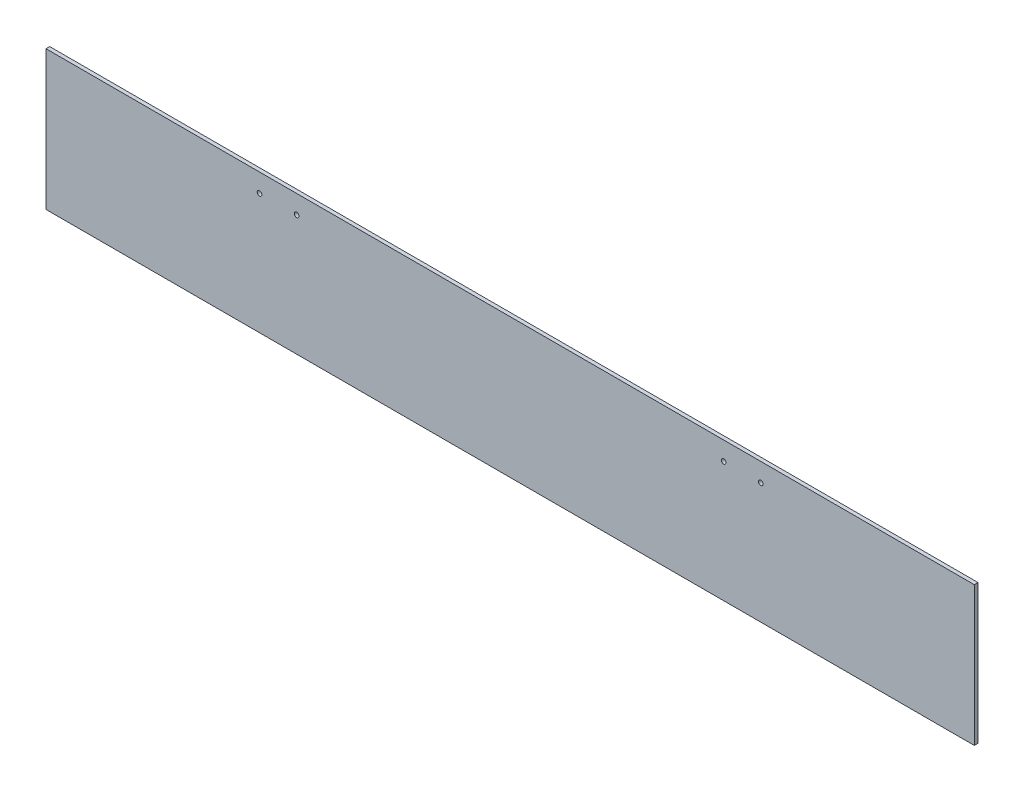
ISO-10303-21;
HEADER;
FILE_DESCRIPTION(('STEP AP214'),'2;1');
FILE_NAME('part.step','',(''),(''),'','','');
FILE_SCHEMA(('AUTOMOTIVE_DESIGN { 1 0 10303 214 1 1 1 1 }'));
ENDSEC;
DATA;
#1=APPLICATION_CONTEXT('core data for automotive mechanical design processes');
#2=APPLICATION_PROTOCOL_DEFINITION('international standard','automotive_design',2000,#1);
#3=PRODUCT_CONTEXT('',#1,'mechanical');
#4=PRODUCT('Part','Part','',(#3));
#5=PRODUCT_RELATED_PRODUCT_CATEGORY('part','',(#4));
#6=PRODUCT_DEFINITION_FORMATION('','',#4);
#7=PRODUCT_DEFINITION_CONTEXT('part definition',#1,'design');
#8=PRODUCT_DEFINITION('design','',#6,#7);
#9=PRODUCT_DEFINITION_SHAPE('','',#8);
#10=(LENGTH_UNIT() NAMED_UNIT(*) SI_UNIT(.MILLI.,.METRE.));
#11=(NAMED_UNIT(*) PLANE_ANGLE_UNIT() SI_UNIT($,.RADIAN.));
#12=(NAMED_UNIT(*) SI_UNIT($,.STERADIAN.) SOLID_ANGLE_UNIT());
#13=UNCERTAINTY_MEASURE_WITH_UNIT(LENGTH_MEASURE(1.E-05),#10,'distance_accuracy_value','');
#14=(GEOMETRIC_REPRESENTATION_CONTEXT(3) GLOBAL_UNCERTAINTY_ASSIGNED_CONTEXT((#13)) GLOBAL_UNIT_ASSIGNED_CONTEXT((#10,
#11,#12)) REPRESENTATION_CONTEXT('',''));
#15=CARTESIAN_POINT('',(0.,0.,0.));
#16=DIRECTION('',(0.,0.,1.));
#17=DIRECTION('',(1.,0.,0.));
#18=AXIS2_PLACEMENT_3D('',#15,#16,#17);
#19=CARTESIAN_POINT('',(-500.000000000002,150.,2.));
#20=DIRECTION('',(1.,0.,0.));
#21=DIRECTION('',(0.,1.,0.));
#22=AXIS2_PLACEMENT_3D('',#19,#20,#21);
#23=PLANE('',#22);
#24=DIRECTION('',(0.,-1.,0.));
#25=VECTOR('',#24,1.);
#26=CARTESIAN_POINT('',(-500.000000000002,150.,-2.));
#27=LINE('',#26,#25);
#28=CARTESIAN_POINT('',(-500.000000000002,150.,-2.));
#29=VERTEX_POINT('',#28);
#30=CARTESIAN_POINT('',(-500.,-1.66533453693773E-13,-2.));
#31=VERTEX_POINT('',#30);
#32=EDGE_CURVE('E105',#29,#31,#27,.T.);
#33=ORIENTED_EDGE('',*,*,#32,.T.);
#34=DIRECTION('',(0.,0.,-1.));
#35=VECTOR('',#34,1.);
#36=CARTESIAN_POINT('',(-500.,-1.66533453693773E-13,2.));
#37=LINE('',#36,#35);
#38=CARTESIAN_POINT('',(-500.,-1.66533453693773E-13,2.));
#39=VERTEX_POINT('',#38);
#40=EDGE_CURVE('E11',#39,#31,#37,.T.);
#41=ORIENTED_EDGE('',*,*,#40,.F.);
#42=DIRECTION('',(0.,-1.,0.));
#43=VECTOR('',#42,1.);
#44=CARTESIAN_POINT('',(-500.000000000002,150.,2.));
#45=LINE('',#44,#43);
#46=CARTESIAN_POINT('',(-500.000000000002,150.,2.));
#47=VERTEX_POINT('',#46);
#48=EDGE_CURVE('E89',#47,#39,#45,.T.);
#49=ORIENTED_EDGE('',*,*,#48,.F.);
#50=DIRECTION('',(0.,0.,-1.));
#51=VECTOR('',#50,1.);
#52=CARTESIAN_POINT('',(-500.000000000002,150.,2.));
#53=LINE('',#52,#51);
#54=EDGE_CURVE('E98',#47,#29,#53,.T.);
#55=ORIENTED_EDGE('',*,*,#54,.T.);
#56=EDGE_LOOP('',(#33,#41,#49,#55));
#57=FACE_BOUND('',#56,.T.);
#58=ADVANCED_FACE('F39',(#57),#23,.F.);
#59=CARTESIAN_POINT('',(500.,1.39628246093065E-13,2.));
#60=DIRECTION('',(0.,1.,0.));
#61=DIRECTION('',(-1.,0.,0.));
#62=AXIS2_PLACEMENT_3D('',#59,#60,#61);
#63=PLANE('',#62);
#64=DIRECTION('',(1.,0.,0.));
#65=VECTOR('',#64,1.);
#66=CARTESIAN_POINT('',(500.,1.39628246093065E-13,-2.));
#67=LINE('',#66,#65);
#68=CARTESIAN_POINT('',(500.,1.39628246093065E-13,-2.));
#69=VERTEX_POINT('',#68);
#70=EDGE_CURVE('E94',#31,#69,#67,.T.);
#71=ORIENTED_EDGE('',*,*,#70,.T.);
#72=DIRECTION('',(0.,0.,-1.));
#73=VECTOR('',#72,1.);
#74=CARTESIAN_POINT('',(500.,1.39628246093065E-13,2.));
#75=LINE('',#74,#73);
#76=CARTESIAN_POINT('',(500.,1.39628246093065E-13,2.));
#77=VERTEX_POINT('',#76);
#78=EDGE_CURVE('E50',#77,#69,#75,.T.);
#79=ORIENTED_EDGE('',*,*,#78,.F.);
#80=DIRECTION('',(1.,0.,0.));
#81=VECTOR('',#80,1.);
#82=CARTESIAN_POINT('',(500.,1.39628246093065E-13,2.));
#83=LINE('',#82,#81);
#84=EDGE_CURVE('E85',#39,#77,#83,.T.);
#85=ORIENTED_EDGE('',*,*,#84,.F.);
#86=ORIENTED_EDGE('',*,*,#40,.T.);
#87=EDGE_LOOP('',(#71,#79,#85,#86));
#88=FACE_BOUND('',#87,.T.);
#89=ADVANCED_FACE('F91',(#88),#63,.F.);
#90=CARTESIAN_POINT('',(500.000000000002,150.,2.));
#91=DIRECTION('',(-1.,0.,0.));
#92=DIRECTION('',(0.,-1.,0.));
#93=AXIS2_PLACEMENT_3D('',#90,#91,#92);
#94=PLANE('',#93);
#95=DIRECTION('',(0.,1.,0.));
#96=VECTOR('',#95,1.);
#97=CARTESIAN_POINT('',(500.000000000002,150.,-2.));
#98=LINE('',#97,#96);
#99=CARTESIAN_POINT('',(500.000000000002,150.,-2.));
#100=VERTEX_POINT('',#99);
#101=EDGE_CURVE('E75',#69,#100,#98,.T.);
#102=ORIENTED_EDGE('',*,*,#101,.T.);
#103=DIRECTION('',(0.,0.,-1.));
#104=VECTOR('',#103,1.);
#105=CARTESIAN_POINT('',(500.000000000002,150.,2.));
#106=LINE('',#105,#104);
#107=CARTESIAN_POINT('',(500.000000000002,150.,2.));
#108=VERTEX_POINT('',#107);
#109=EDGE_CURVE('E92',#108,#100,#106,.T.);
#110=ORIENTED_EDGE('',*,*,#109,.F.);
#111=DIRECTION('',(0.,1.,0.));
#112=VECTOR('',#111,1.);
#113=CARTESIAN_POINT('',(500.000000000002,150.,2.));
#114=LINE('',#113,#112);
#115=EDGE_CURVE('E86',#77,#108,#114,.T.);
#116=ORIENTED_EDGE('',*,*,#115,.F.);
#117=ORIENTED_EDGE('',*,*,#78,.T.);
#118=EDGE_LOOP('',(#102,#110,#116,#117));
#119=FACE_BOUND('',#118,.T.);
#120=ADVANCED_FACE('F96',(#119),#94,.F.);
#121=CARTESIAN_POINT('',(500.000000000002,150.,2.));
#122=DIRECTION('',(0.,-1.,0.));
#123=DIRECTION('',(1.,0.,0.));
#124=AXIS2_PLACEMENT_3D('',#121,#122,#123);
#125=PLANE('',#124);
#126=DIRECTION('',(-1.,0.,0.));
#127=VECTOR('',#126,1.);
#128=CARTESIAN_POINT('',(500.000000000002,150.,-2.));
#129=LINE('',#128,#127);
#130=EDGE_CURVE('E80',#100,#29,#129,.T.);
#131=ORIENTED_EDGE('',*,*,#130,.T.);
#132=ORIENTED_EDGE('',*,*,#54,.F.);
#133=DIRECTION('',(-1.,0.,0.));
#134=VECTOR('',#133,1.);
#135=CARTESIAN_POINT('',(500.000000000002,150.,2.));
#136=LINE('',#135,#134);
#137=EDGE_CURVE('E54',#108,#47,#136,.T.);
#138=ORIENTED_EDGE('',*,*,#137,.F.);
#139=ORIENTED_EDGE('',*,*,#109,.T.);
#140=EDGE_LOOP('',(#131,#132,#138,#139));
#141=FACE_BOUND('',#140,.T.);
#142=ADVANCED_FACE('F109',(#141),#125,.F.);
#143=CARTESIAN_POINT('',(0.,0.,2.));
#144=DIRECTION('',(0.,0.,-1.));
#145=DIRECTION('',(-1.,0.,0.));
#146=AXIS2_PLACEMENT_3D('',#143,#144,#145);
#147=PLANE('',#146);
#148=CARTESIAN_POINT('',(-270.000000000002,130.,2.));
#149=DIRECTION('',(0.,0.,1.));
#150=DIRECTION('',(1.,0.,0.));
#151=AXIS2_PLACEMENT_3D('',#148,#149,#150);
#152=CIRCLE('',#151,2.5);
#153=CARTESIAN_POINT('',(-267.500000000002,130.,2.));
#154=VERTEX_POINT('',#153);
#155=EDGE_CURVE('E136',#154,#154,#152,.T.);
#156=ORIENTED_EDGE('',*,*,#155,.F.);
#157=EDGE_LOOP('',(#156));
#158=FACE_BOUND('',#157,.T.);
#159=CARTESIAN_POINT('',(-230.000000000002,130.,2.));
#160=DIRECTION('',(0.,0.,1.));
#161=DIRECTION('',(1.,0.,0.));
#162=AXIS2_PLACEMENT_3D('',#159,#160,#161);
#163=CIRCLE('',#162,2.5);
#164=CARTESIAN_POINT('',(-227.500000000002,130.,2.));
#165=VERTEX_POINT('',#164);
#166=EDGE_CURVE('E128',#165,#165,#163,.T.);
#167=ORIENTED_EDGE('',*,*,#166,.F.);
#168=EDGE_LOOP('',(#167));
#169=FACE_BOUND('',#168,.T.);
#170=CARTESIAN_POINT('',(230.000000000002,130.,2.));
#171=DIRECTION('',(0.,0.,1.));
#172=DIRECTION('',(1.,0.,0.));
#173=AXIS2_PLACEMENT_3D('',#170,#171,#172);
#174=CIRCLE('',#173,2.5);
#175=CARTESIAN_POINT('',(232.500000000002,130.,2.));
#176=VERTEX_POINT('',#175);
#177=EDGE_CURVE('E123',#176,#176,#174,.T.);
#178=ORIENTED_EDGE('',*,*,#177,.F.);
#179=EDGE_LOOP('',(#178));
#180=FACE_BOUND('',#179,.T.);
#181=CARTESIAN_POINT('',(270.000000000002,130.,2.));
#182=DIRECTION('',(0.,0.,1.));
#183=DIRECTION('',(1.,0.,0.));
#184=AXIS2_PLACEMENT_3D('',#181,#182,#183);
#185=CIRCLE('',#184,2.5);
#186=CARTESIAN_POINT('',(272.500000000002,130.,2.));
#187=VERTEX_POINT('',#186);
#188=EDGE_CURVE('E120',#187,#187,#185,.T.);
#189=ORIENTED_EDGE('',*,*,#188,.F.);
#190=EDGE_LOOP('',(#189));
#191=FACE_BOUND('',#190,.T.);
#192=ORIENTED_EDGE('',*,*,#48,.T.);
#193=ORIENTED_EDGE('',*,*,#84,.T.);
#194=ORIENTED_EDGE('',*,*,#115,.T.);
#195=ORIENTED_EDGE('',*,*,#137,.T.);
#196=EDGE_LOOP('',(#192,#193,#194,#195));
#197=FACE_BOUND('',#196,.T.);
#198=ADVANCED_FACE('F88',(#158,#169,#180,#191,#197),#147,.F.);
#199=CARTESIAN_POINT('',(0.,0.,-2.));
#200=DIRECTION('',(0.,0.,-1.));
#201=DIRECTION('',(-1.,0.,0.));
#202=AXIS2_PLACEMENT_3D('',#199,#200,#201);
#203=PLANE('',#202);
#204=CARTESIAN_POINT('',(-270.000000000002,130.,-2.));
#205=DIRECTION('',(0.,0.,1.));
#206=DIRECTION('',(1.,0.,0.));
#207=AXIS2_PLACEMENT_3D('',#204,#205,#206);
#208=CIRCLE('',#207,2.5);
#209=CARTESIAN_POINT('',(-267.500000000002,130.,-2.));
#210=VERTEX_POINT('',#209);
#211=EDGE_CURVE('E135',#210,#210,#208,.T.);
#212=ORIENTED_EDGE('',*,*,#211,.T.);
#213=EDGE_LOOP('',(#212));
#214=FACE_BOUND('',#213,.T.);
#215=CARTESIAN_POINT('',(-230.000000000002,130.,-2.));
#216=DIRECTION('',(0.,0.,1.));
#217=DIRECTION('',(1.,0.,0.));
#218=AXIS2_PLACEMENT_3D('',#215,#216,#217);
#219=CIRCLE('',#218,2.5);
#220=CARTESIAN_POINT('',(-227.500000000002,130.,-2.));
#221=VERTEX_POINT('',#220);
#222=EDGE_CURVE('E130',#221,#221,#219,.T.);
#223=ORIENTED_EDGE('',*,*,#222,.T.);
#224=EDGE_LOOP('',(#223));
#225=FACE_BOUND('',#224,.T.);
#226=CARTESIAN_POINT('',(230.000000000002,130.,-2.));
#227=DIRECTION('',(0.,0.,1.));
#228=DIRECTION('',(1.,0.,0.));
#229=AXIS2_PLACEMENT_3D('',#226,#227,#228);
#230=CIRCLE('',#229,2.5);
#231=CARTESIAN_POINT('',(232.500000000002,130.,-2.));
#232=VERTEX_POINT('',#231);
#233=EDGE_CURVE('E121',#232,#232,#230,.T.);
#234=ORIENTED_EDGE('',*,*,#233,.T.);
#235=EDGE_LOOP('',(#234));
#236=FACE_BOUND('',#235,.T.);
#237=CARTESIAN_POINT('',(270.000000000002,130.,-2.));
#238=DIRECTION('',(0.,0.,1.));
#239=DIRECTION('',(1.,0.,0.));
#240=AXIS2_PLACEMENT_3D('',#237,#238,#239);
#241=CIRCLE('',#240,2.5);
#242=CARTESIAN_POINT('',(272.500000000002,130.,-2.));
#243=VERTEX_POINT('',#242);
#244=EDGE_CURVE('E104',#243,#243,#241,.T.);
#245=ORIENTED_EDGE('',*,*,#244,.T.);
#246=EDGE_LOOP('',(#245));
#247=FACE_BOUND('',#246,.T.);
#248=ORIENTED_EDGE('',*,*,#32,.F.);
#249=ORIENTED_EDGE('',*,*,#130,.F.);
#250=ORIENTED_EDGE('',*,*,#101,.F.);
#251=ORIENTED_EDGE('',*,*,#70,.F.);
#252=EDGE_LOOP('',(#248,#249,#250,#251));
#253=FACE_BOUND('',#252,.T.);
#254=ADVANCED_FACE('F114',(#214,#225,#236,#247,#253),#203,.T.);
#255=CARTESIAN_POINT('',(270.000000000002,130.,2.));
#256=DIRECTION('',(0.,0.,1.));
#257=DIRECTION('',(1.,0.,0.));
#258=AXIS2_PLACEMENT_3D('',#255,#256,#257);
#259=CYLINDRICAL_SURFACE('',#258,2.5);
#260=ORIENTED_EDGE('',*,*,#244,.F.);
#261=EDGE_LOOP('',(#260));
#262=FACE_BOUND('',#261,.T.);
#263=ORIENTED_EDGE('',*,*,#188,.T.);
#264=EDGE_LOOP('',(#263));
#265=FACE_BOUND('',#264,.T.);
#266=ADVANCED_FACE('F151',(#262,#265),#259,.F.);
#267=CARTESIAN_POINT('',(230.000000000002,130.,2.));
#268=DIRECTION('',(0.,0.,1.));
#269=DIRECTION('',(1.,0.,0.));
#270=AXIS2_PLACEMENT_3D('',#267,#268,#269);
#271=CYLINDRICAL_SURFACE('',#270,2.5);
#272=ORIENTED_EDGE('',*,*,#233,.F.);
#273=EDGE_LOOP('',(#272));
#274=FACE_BOUND('',#273,.T.);
#275=ORIENTED_EDGE('',*,*,#177,.T.);
#276=EDGE_LOOP('',(#275));
#277=FACE_BOUND('',#276,.T.);
#278=ADVANCED_FACE('F153',(#274,#277),#271,.F.);
#279=CARTESIAN_POINT('',(-230.000000000002,130.,2.));
#280=DIRECTION('',(0.,0.,1.));
#281=DIRECTION('',(1.,0.,0.));
#282=AXIS2_PLACEMENT_3D('',#279,#280,#281);
#283=CYLINDRICAL_SURFACE('',#282,2.5);
#284=ORIENTED_EDGE('',*,*,#222,.F.);
#285=EDGE_LOOP('',(#284));
#286=FACE_BOUND('',#285,.T.);
#287=ORIENTED_EDGE('',*,*,#166,.T.);
#288=EDGE_LOOP('',(#287));
#289=FACE_BOUND('',#288,.T.);
#290=ADVANCED_FACE('F159',(#286,#289),#283,.F.);
#291=CARTESIAN_POINT('',(-270.000000000002,130.,2.));
#292=DIRECTION('',(0.,0.,1.));
#293=DIRECTION('',(1.,0.,0.));
#294=AXIS2_PLACEMENT_3D('',#291,#292,#293);
#295=CYLINDRICAL_SURFACE('',#294,2.5);
#296=ORIENTED_EDGE('',*,*,#211,.F.);
#297=EDGE_LOOP('',(#296));
#298=FACE_BOUND('',#297,.T.);
#299=ORIENTED_EDGE('',*,*,#155,.T.);
#300=EDGE_LOOP('',(#299));
#301=FACE_BOUND('',#300,.T.);
#302=ADVANCED_FACE('F140',(#298,#301),#295,.F.);
#303=CLOSED_SHELL('',(#58,#89,#120,#142,#198,#254,#266,#278,#290,#302));
#304=MANIFOLD_SOLID_BREP('B2',#303);
#305=ADVANCED_BREP_SHAPE_REPRESENTATION('',(#18,#304),#14);
#306=SHAPE_DEFINITION_REPRESENTATION(#9,#305);
ENDSEC;
END-ISO-10303-21;
